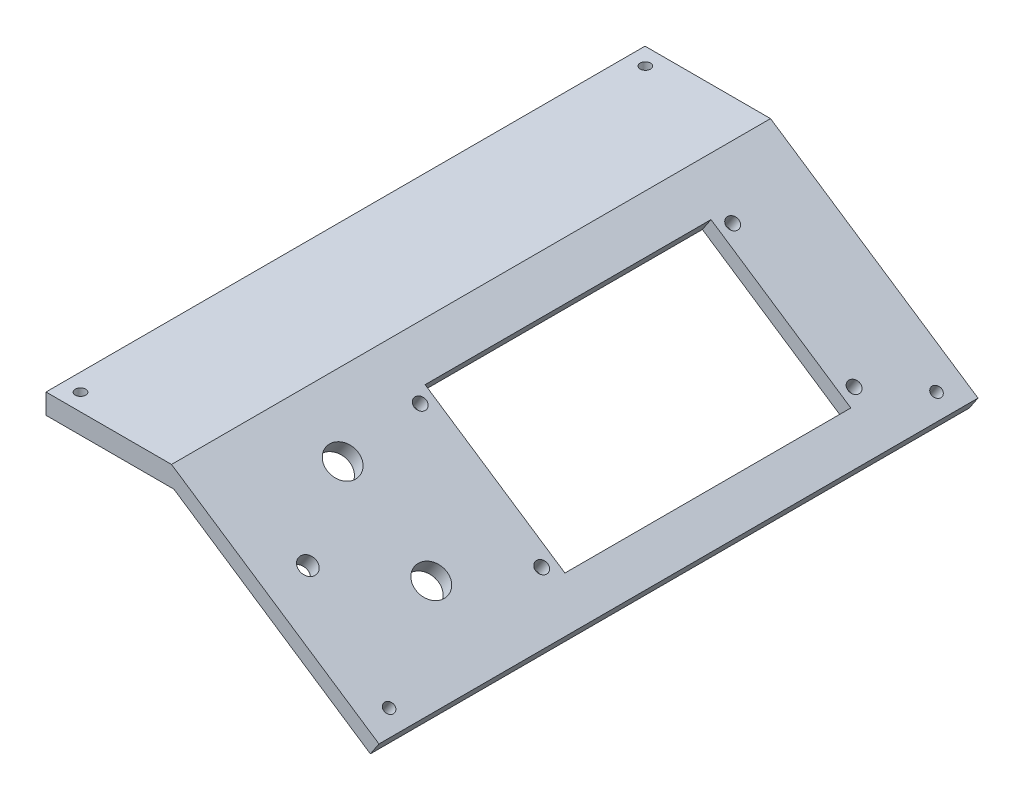
ISO-10303-21;
HEADER;
FILE_DESCRIPTION(('STEP AP214'),'2;1');
FILE_NAME('part.step','',(''),(''),'','','');
FILE_SCHEMA(('AUTOMOTIVE_DESIGN { 1 0 10303 214 1 1 1 1 }'));
ENDSEC;
DATA;
#1=APPLICATION_CONTEXT('core data for automotive mechanical design processes');
#2=APPLICATION_PROTOCOL_DEFINITION('international standard','automotive_design',2000,#1);
#3=PRODUCT_CONTEXT('',#1,'mechanical');
#4=PRODUCT('Part','Part','',(#3));
#5=PRODUCT_RELATED_PRODUCT_CATEGORY('part','',(#4));
#6=PRODUCT_DEFINITION_FORMATION('','',#4);
#7=PRODUCT_DEFINITION_CONTEXT('part definition',#1,'design');
#8=PRODUCT_DEFINITION('design','',#6,#7);
#9=PRODUCT_DEFINITION_SHAPE('','',#8);
#10=(LENGTH_UNIT() NAMED_UNIT(*) SI_UNIT(.MILLI.,.METRE.));
#11=(NAMED_UNIT(*) PLANE_ANGLE_UNIT() SI_UNIT($,.RADIAN.));
#12=(NAMED_UNIT(*) SI_UNIT($,.STERADIAN.) SOLID_ANGLE_UNIT());
#13=UNCERTAINTY_MEASURE_WITH_UNIT(LENGTH_MEASURE(1.E-05),#10,'distance_accuracy_value','');
#14=(GEOMETRIC_REPRESENTATION_CONTEXT(3) GLOBAL_UNCERTAINTY_ASSIGNED_CONTEXT((#13)) GLOBAL_UNIT_ASSIGNED_CONTEXT((#10,
#11,#12)) REPRESENTATION_CONTEXT('',''));
#15=CARTESIAN_POINT('',(0.,0.,0.));
#16=DIRECTION('',(0.,0.,1.));
#17=DIRECTION('',(1.,0.,0.));
#18=AXIS2_PLACEMENT_3D('',#15,#16,#17);
#19=CARTESIAN_POINT('',(0.,0.,171.8));
#20=DIRECTION('',(1.,0.,0.));
#21=DIRECTION('',(0.,1.,0.));
#22=AXIS2_PLACEMENT_3D('',#19,#20,#21);
#23=PLANE('',#22);
#24=DIRECTION('',(0.,-1.,0.));
#25=VECTOR('',#24,1.);
#26=CARTESIAN_POINT('',(0.,0.,0.));
#27=LINE('',#26,#25);
#28=CARTESIAN_POINT('',(0.,0.,0.));
#29=VERTEX_POINT('',#28);
#30=CARTESIAN_POINT('',(0.,-5.8,0.));
#31=VERTEX_POINT('',#30);
#32=EDGE_CURVE('E214',#29,#31,#27,.T.);
#33=ORIENTED_EDGE('',*,*,#32,.T.);
#34=DIRECTION('',(0.,0.,-1.));
#35=VECTOR('',#34,1.);
#36=CARTESIAN_POINT('',(0.,-5.8,171.8));
#37=LINE('',#36,#35);
#38=CARTESIAN_POINT('',(0.,-5.8,171.8));
#39=VERTEX_POINT('',#38);
#40=EDGE_CURVE('E11',#39,#31,#37,.T.);
#41=ORIENTED_EDGE('',*,*,#40,.F.);
#42=DIRECTION('',(0.,-1.,0.));
#43=VECTOR('',#42,1.);
#44=CARTESIAN_POINT('',(0.,0.,171.8));
#45=LINE('',#44,#43);
#46=CARTESIAN_POINT('',(0.,0.,171.8));
#47=VERTEX_POINT('',#46);
#48=EDGE_CURVE('E215',#47,#39,#45,.T.);
#49=ORIENTED_EDGE('',*,*,#48,.F.);
#50=DIRECTION('',(0.,0.,-1.));
#51=VECTOR('',#50,1.);
#52=CARTESIAN_POINT('',(0.,0.,171.8));
#53=LINE('',#52,#51);
#54=EDGE_CURVE('E235',#47,#29,#53,.T.);
#55=ORIENTED_EDGE('',*,*,#54,.T.);
#56=EDGE_LOOP('',(#33,#41,#49,#55));
#57=FACE_BOUND('',#56,.T.);
#58=ADVANCED_FACE('F38',(#57),#23,.F.);
#59=CARTESIAN_POINT('',(0.,-5.8,171.8));
#60=DIRECTION('',(0.,1.,0.));
#61=DIRECTION('',(0.,0.,1.));
#62=AXIS2_PLACEMENT_3D('',#59,#60,#61);
#63=PLANE('',#62);
#64=CARTESIAN_POINT('',(5.,-5.8,166.9));
#65=DIRECTION('',(0.,1.,0.));
#66=DIRECTION('',(0.,0.,1.));
#67=AXIS2_PLACEMENT_3D('',#64,#65,#66);
#68=CIRCLE('',#67,1.5);
#69=CARTESIAN_POINT('',(5.,-5.8,168.4));
#70=VERTEX_POINT('',#69);
#71=EDGE_CURVE('E161',#70,#70,#68,.T.);
#72=ORIENTED_EDGE('',*,*,#71,.T.);
#73=EDGE_LOOP('',(#72));
#74=FACE_BOUND('',#73,.T.);
#75=CARTESIAN_POINT('',(5.,-5.8,4.90000000000001));
#76=DIRECTION('',(0.,1.,0.));
#77=DIRECTION('',(0.,0.,1.));
#78=AXIS2_PLACEMENT_3D('',#75,#76,#77);
#79=CIRCLE('',#78,1.5);
#80=CARTESIAN_POINT('',(5.,-5.8,6.40000000000001));
#81=VERTEX_POINT('',#80);
#82=EDGE_CURVE('E506',#81,#81,#79,.T.);
#83=ORIENTED_EDGE('',*,*,#82,.T.);
#84=EDGE_LOOP('',(#83));
#85=FACE_BOUND('',#84,.T.);
#86=DIRECTION('',(1.,0.,0.));
#87=VECTOR('',#86,1.);
#88=CARTESIAN_POINT('',(0.,-5.8,0.));
#89=LINE('',#88,#87);
#90=CARTESIAN_POINT('',(36.6776484120926,-5.8,0.));
#91=VERTEX_POINT('',#90);
#92=EDGE_CURVE('E239',#31,#91,#89,.T.);
#93=ORIENTED_EDGE('',*,*,#92,.T.);
#94=DIRECTION('',(0.,0.,-1.));
#95=VECTOR('',#94,1.);
#96=CARTESIAN_POINT('',(36.6776484120926,-5.8,171.8));
#97=LINE('',#96,#95);
#98=CARTESIAN_POINT('',(36.6776484120926,-5.8,171.8));
#99=VERTEX_POINT('',#98);
#100=EDGE_CURVE('E46',#99,#91,#97,.T.);
#101=ORIENTED_EDGE('',*,*,#100,.F.);
#102=DIRECTION('',(1.,0.,0.));
#103=VECTOR('',#102,1.);
#104=CARTESIAN_POINT('',(0.,-5.8,171.8));
#105=LINE('',#104,#103);
#106=EDGE_CURVE('E219',#39,#99,#105,.T.);
#107=ORIENTED_EDGE('',*,*,#106,.F.);
#108=ORIENTED_EDGE('',*,*,#40,.T.);
#109=EDGE_LOOP('',(#93,#101,#107,#108));
#110=FACE_BOUND('',#109,.T.);
#111=ADVANCED_FACE('F295',(#74,#85,#110),#63,.F.);
#112=CARTESIAN_POINT('',(93.032353950195,-43.3698036920683,171.8));
#113=DIRECTION('',(0.554700196225229,0.832050294337844,0.));
#114=DIRECTION('',(-0.832050294337844,0.554700196225229,0.));
#115=AXIS2_PLACEMENT_3D('',#112,#113,#114);
#116=PLANE('',#115);
#117=CARTESIAN_POINT('',(88.5392823607707,-40.374422632452,7.40000000000001));
#118=DIRECTION('',(0.554700196225229,0.832050294337844,0.));
#119=DIRECTION('',(-0.832050294337844,0.554700196225229,0.));
#120=AXIS2_PLACEMENT_3D('',#117,#118,#119);
#121=CIRCLE('',#120,1.5);
#122=CARTESIAN_POINT('',(87.2912069192639,-39.5423723381142,7.40000000000001));
#123=VERTEX_POINT('',#122);
#124=EDGE_CURVE('E210',#123,#123,#121,.T.);
#125=ORIENTED_EDGE('',*,*,#124,.T.);
#126=EDGE_LOOP('',(#125));
#127=FACE_BOUND('',#126,.T.);
#128=CARTESIAN_POINT('',(45.8671563780053,-11.9263386439418,112.8));
#129=DIRECTION('',(0.554700196225229,0.832050294337844,0.));
#130=DIRECTION('',(-0.832050294337844,0.554700196225229,0.));
#131=AXIS2_PLACEMENT_3D('',#128,#129,#130);
#132=CIRCLE('',#131,1.75000000000001);
#133=CARTESIAN_POINT('',(44.4110683629141,-10.9556133005476,112.8));
#134=VERTEX_POINT('',#133);
#135=EDGE_CURVE('E206',#134,#134,#132,.T.);
#136=ORIENTED_EDGE('',*,*,#135,.T.);
#137=EDGE_LOOP('',(#136));
#138=FACE_BOUND('',#137,.T.);
#139=CARTESIAN_POINT('',(60.3327773827178,-21.5700859804168,159.5));
#140=DIRECTION('',(0.554700196225229,0.832050294337844,0.));
#141=DIRECTION('',(-0.832050294337844,0.554700196225229,0.));
#142=AXIS2_PLACEMENT_3D('',#139,#140,#141);
#143=CIRCLE('',#142,2.5);
#144=CARTESIAN_POINT('',(58.2526516468732,-20.1833354898537,159.5));
#145=VERTEX_POINT('',#144);
#146=EDGE_CURVE('E202',#145,#145,#143,.T.);
#147=ORIENTED_EDGE('',*,*,#146,.T.);
#148=EDGE_LOOP('',(#147));
#149=FACE_BOUND('',#148,.T.);
#150=CARTESIAN_POINT('',(73.2295569449544,-30.1679390219078,137.));
#151=DIRECTION('',(0.554700196225229,0.832050294337844,0.));
#152=DIRECTION('',(-0.832050294337844,0.554700196225229,0.));
#153=AXIS2_PLACEMENT_3D('',#150,#151,#152);
#154=CIRCLE('',#153,4.50000000000001);
#155=CARTESIAN_POINT('',(69.4853306204341,-27.6717881388943,137.));
#156=VERTEX_POINT('',#155);
#157=EDGE_CURVE('E198',#156,#156,#154,.T.);
#158=ORIENTED_EDGE('',*,*,#157,.T.);
#159=EDGE_LOOP('',(#158));
#160=FACE_BOUND('',#159,.T.);
#161=DIRECTION('',(0.,0.,-1.));
#162=VECTOR('',#161,1.);
#163=CARTESIAN_POINT('',(83.5623532528284,-37.0564698938239,171.8));
#164=LINE('',#163,#162);
#165=CARTESIAN_POINT('',(83.5623532528284,-37.0564698938239,109.));
#166=VERTEX_POINT('',#165);
#167=CARTESIAN_POINT('',(83.5623532528284,-37.0564698938239,27.));
#168=VERTEX_POINT('',#167);
#169=EDGE_CURVE('E190',#166,#168,#164,.T.);
#170=ORIENTED_EDGE('',*,*,#169,.T.);
#171=DIRECTION('',(-0.832050294337844,0.554700196225229,0.));
#172=VECTOR('',#171,1.);
#173=CARTESIAN_POINT('',(93.032353950195,-43.3698036920683,27.));
#174=LINE('',#173,#172);
#175=CARTESIAN_POINT('',(43.4575290657444,-10.3199204357678,27.));
#176=VERTEX_POINT('',#175);
#177=EDGE_CURVE('E194',#168,#176,#174,.T.);
#178=ORIENTED_EDGE('',*,*,#177,.T.);
#179=DIRECTION('',(0.,0.,1.));
#180=VECTOR('',#179,1.);
#181=CARTESIAN_POINT('',(43.4575290657444,-10.3199204357678,171.8));
#182=LINE('',#181,#180);
#183=CARTESIAN_POINT('',(43.4575290657444,-10.3199204357678,109.));
#184=VERTEX_POINT('',#183);
#185=EDGE_CURVE('E185',#176,#184,#182,.T.);
#186=ORIENTED_EDGE('',*,*,#185,.T.);
#187=DIRECTION('',(0.832050294337844,-0.554700196225229,0.));
#188=VECTOR('',#187,1.);
#189=CARTESIAN_POINT('',(93.032353950195,-43.3698036920683,109.));
#190=LINE('',#189,#188);
#191=EDGE_CURVE('E121',#184,#166,#190,.T.);
#192=ORIENTED_EDGE('',*,*,#191,.T.);
#193=EDGE_LOOP('',(#170,#178,#186,#192));
#194=FACE_BOUND('',#193,.T.);
#195=CARTESIAN_POINT('',(88.5392823607707,-40.374422632452,164.4));
#196=DIRECTION('',(0.554700196225229,0.832050294337844,0.));
#197=DIRECTION('',(-0.832050294337844,0.554700196225229,0.));
#198=AXIS2_PLACEMENT_3D('',#195,#196,#197);
#199=CIRCLE('',#198,1.5);
#200=CARTESIAN_POINT('',(87.2912069192639,-39.5423723381142,164.4));
#201=VERTEX_POINT('',#200);
#202=EDGE_CURVE('E181',#201,#201,#199,.T.);
#203=ORIENTED_EDGE('',*,*,#202,.T.);
#204=EDGE_LOOP('',(#203));
#205=FACE_BOUND('',#204,.T.);
#206=CARTESIAN_POINT('',(80.6967816989875,-35.1460888579299,23.2));
#207=DIRECTION('',(0.554700196225229,0.832050294337844,0.));
#208=DIRECTION('',(-0.832050294337844,0.554700196225229,0.));
#209=AXIS2_PLACEMENT_3D('',#206,#207,#208);
#210=CIRCLE('',#209,1.74999999999999);
#211=CARTESIAN_POINT('',(79.2406936838962,-34.1753635145357,23.2));
#212=VERTEX_POINT('',#211);
#213=EDGE_CURVE('E177',#212,#212,#210,.T.);
#214=ORIENTED_EDGE('',*,*,#213,.T.);
#215=EDGE_LOOP('',(#214));
#216=FACE_BOUND('',#215,.T.);
#217=CARTESIAN_POINT('',(45.8671563780053,-11.9263386439418,23.2));
#218=DIRECTION('',(0.554700196225229,0.832050294337844,0.));
#219=DIRECTION('',(-0.832050294337844,0.554700196225229,0.));
#220=AXIS2_PLACEMENT_3D('',#217,#218,#219);
#221=CIRCLE('',#220,1.75000000000001);
#222=CARTESIAN_POINT('',(44.4110683629141,-10.9556133005476,23.2));
#223=VERTEX_POINT('',#222);
#224=EDGE_CURVE('E173',#223,#223,#221,.T.);
#225=ORIENTED_EDGE('',*,*,#224,.T.);
#226=EDGE_LOOP('',(#225));
#227=FACE_BOUND('',#226,.T.);
#228=CARTESIAN_POINT('',(80.6967816989875,-35.1460888579299,112.8));
#229=DIRECTION('',(0.554700196225229,0.832050294337844,0.));
#230=DIRECTION('',(-0.832050294337844,0.554700196225229,0.));
#231=AXIS2_PLACEMENT_3D('',#228,#229,#230);
#232=CIRCLE('',#231,1.74999999999999);
#233=CARTESIAN_POINT('',(79.2406936838962,-34.1753635145357,112.8));
#234=VERTEX_POINT('',#233);
#235=EDGE_CURVE('E169',#234,#234,#232,.T.);
#236=ORIENTED_EDGE('',*,*,#235,.T.);
#237=EDGE_LOOP('',(#236));
#238=FACE_BOUND('',#237,.T.);
#239=CARTESIAN_POINT('',(47.8131944490798,-13.2236973579914,137.));
#240=DIRECTION('',(0.554700196225229,0.832050294337844,0.));
#241=DIRECTION('',(-0.832050294337844,0.554700196225229,0.));
#242=AXIS2_PLACEMENT_3D('',#239,#240,#241);
#243=CIRCLE('',#242,4.5);
#244=CARTESIAN_POINT('',(44.0689681245595,-10.7275464749779,137.));
#245=VERTEX_POINT('',#244);
#246=EDGE_CURVE('E165',#245,#245,#243,.T.);
#247=ORIENTED_EDGE('',*,*,#246,.T.);
#248=EDGE_LOOP('',(#247));
#249=FACE_BOUND('',#248,.T.);
#250=DIRECTION('',(0.832050294337844,-0.554700196225229,0.));
#251=VECTOR('',#250,1.);
#252=CARTESIAN_POINT('',(93.032353950195,-43.3698036920683,0.));
#253=LINE('',#252,#251);
#254=CARTESIAN_POINT('',(93.032353950195,-43.3698036920683,0.));
#255=VERTEX_POINT('',#254);
#256=EDGE_CURVE('E242',#91,#255,#253,.T.);
#257=ORIENTED_EDGE('',*,*,#256,.T.);
#258=DIRECTION('',(0.,0.,-1.));
#259=VECTOR('',#258,1.);
#260=CARTESIAN_POINT('',(93.032353950195,-43.3698036920683,171.8));
#261=LINE('',#260,#259);
#262=CARTESIAN_POINT('',(93.032353950195,-43.3698036920683,171.8));
#263=VERTEX_POINT('',#262);
#264=EDGE_CURVE('E264',#263,#255,#261,.T.);
#265=ORIENTED_EDGE('',*,*,#264,.F.);
#266=DIRECTION('',(0.832050294337844,-0.554700196225229,0.));
#267=VECTOR('',#266,1.);
#268=CARTESIAN_POINT('',(93.032353950195,-43.3698036920683,171.8));
#269=LINE('',#268,#267);
#270=EDGE_CURVE('E223',#99,#263,#269,.T.);
#271=ORIENTED_EDGE('',*,*,#270,.F.);
#272=ORIENTED_EDGE('',*,*,#100,.T.);
#273=EDGE_LOOP('',(#257,#265,#271,#272));
#274=FACE_BOUND('',#273,.T.);
#275=ADVANCED_FACE('F273',(#127,#138,#149,#160,#194,#205,#216,#227,#238,#249,#274),#116,.F.);
#276=CARTESIAN_POINT('',(95.5007698233973,-39.6671798822649,171.8));
#277=DIRECTION('',(-0.832050294337843,0.554700196225231,0.));
#278=DIRECTION('',(-0.554700196225231,-0.832050294337843,0.));
#279=AXIS2_PLACEMENT_3D('',#276,#277,#278);
#280=PLANE('',#279);
#281=DIRECTION('',(0.554700196225231,0.832050294337843,0.));
#282=VECTOR('',#281,1.);
#283=CARTESIAN_POINT('',(95.5007698233973,-39.6671798822649,0.));
#284=LINE('',#283,#282);
#285=CARTESIAN_POINT('',(95.5007698233973,-39.6671798822649,0.));
#286=VERTEX_POINT('',#285);
#287=EDGE_CURVE('E245',#255,#286,#284,.T.);
#288=ORIENTED_EDGE('',*,*,#287,.T.);
#289=DIRECTION('',(0.,0.,-1.));
#290=VECTOR('',#289,1.);
#291=CARTESIAN_POINT('',(95.5007698233973,-39.6671798822649,171.8));
#292=LINE('',#291,#290);
#293=CARTESIAN_POINT('',(95.5007698233973,-39.6671798822649,171.8));
#294=VERTEX_POINT('',#293);
#295=EDGE_CURVE('E260',#294,#286,#292,.T.);
#296=ORIENTED_EDGE('',*,*,#295,.F.);
#297=DIRECTION('',(0.554700196225231,0.832050294337843,0.));
#298=VECTOR('',#297,1.);
#299=CARTESIAN_POINT('',(95.5007698233973,-39.6671798822649,171.8));
#300=LINE('',#299,#298);
#301=EDGE_CURVE('E226',#263,#294,#300,.T.);
#302=ORIENTED_EDGE('',*,*,#301,.F.);
#303=ORIENTED_EDGE('',*,*,#264,.T.);
#304=EDGE_LOOP('',(#288,#296,#302,#303));
#305=FACE_BOUND('',#304,.T.);
#306=ADVANCED_FACE('F284',(#305),#280,.F.);
#307=CARTESIAN_POINT('',(95.5007698233973,-39.6671798822649,171.8));
#308=DIRECTION('',(-0.554700196225229,-0.832050294337844,0.));
#309=DIRECTION('',(0.832050294337844,-0.554700196225229,0.));
#310=AXIS2_PLACEMENT_3D('',#307,#308,#309);
#311=PLANE('',#310);
#312=CARTESIAN_POINT('',(91.0076982339729,-36.6717988226486,7.40000000000001));
#313=DIRECTION('',(0.554700196225229,0.832050294337844,0.));
#314=DIRECTION('',(-0.832050294337844,0.554700196225229,0.));
#315=AXIS2_PLACEMENT_3D('',#312,#313,#314);
#316=CIRCLE('',#315,1.5);
#317=CARTESIAN_POINT('',(89.7596227924662,-35.8397485283108,7.40000000000001));
#318=VERTEX_POINT('',#317);
#319=EDGE_CURVE('E156',#318,#318,#316,.T.);
#320=ORIENTED_EDGE('',*,*,#319,.F.);
#321=EDGE_LOOP('',(#320));
#322=FACE_BOUND('',#321,.T.);
#323=CARTESIAN_POINT('',(48.3355722512076,-8.22371483413838,112.8));
#324=DIRECTION('',(0.554700196225229,0.832050294337844,0.));
#325=DIRECTION('',(-0.832050294337844,0.554700196225229,0.));
#326=AXIS2_PLACEMENT_3D('',#323,#324,#325);
#327=CIRCLE('',#326,1.75000000000001);
#328=CARTESIAN_POINT('',(46.8794842361163,-7.25298949074423,112.8));
#329=VERTEX_POINT('',#328);
#330=EDGE_CURVE('E525',#329,#329,#327,.T.);
#331=ORIENTED_EDGE('',*,*,#330,.F.);
#332=EDGE_LOOP('',(#331));
#333=FACE_BOUND('',#332,.T.);
#334=CARTESIAN_POINT('',(62.8011932559201,-17.8674621706134,159.5));
#335=DIRECTION('',(0.554700196225229,0.832050294337844,0.));
#336=DIRECTION('',(-0.832050294337844,0.554700196225229,0.));
#337=AXIS2_PLACEMENT_3D('',#334,#335,#336);
#338=CIRCLE('',#337,2.5);
#339=CARTESIAN_POINT('',(60.7210675200754,-16.4807116800503,159.5));
#340=VERTEX_POINT('',#339);
#341=EDGE_CURVE('E155',#340,#340,#338,.T.);
#342=ORIENTED_EDGE('',*,*,#341,.F.);
#343=EDGE_LOOP('',(#342));
#344=FACE_BOUND('',#343,.T.);
#345=CARTESIAN_POINT('',(75.6979728181566,-26.4653152121044,137.));
#346=DIRECTION('',(0.554700196225229,0.832050294337844,0.));
#347=DIRECTION('',(-0.832050294337844,0.554700196225229,0.));
#348=AXIS2_PLACEMENT_3D('',#345,#346,#347);
#349=CIRCLE('',#348,4.50000000000001);
#350=CARTESIAN_POINT('',(71.9537464936363,-23.9691643290909,137.));
#351=VERTEX_POINT('',#350);
#352=EDGE_CURVE('E151',#351,#351,#349,.T.);
#353=ORIENTED_EDGE('',*,*,#352,.F.);
#354=EDGE_LOOP('',(#353));
#355=FACE_BOUND('',#354,.T.);
#356=DIRECTION('',(0.,0.,1.));
#357=VECTOR('',#356,1.);
#358=CARTESIAN_POINT('',(45.9259449389466,-6.61729662596443,27.));
#359=LINE('',#358,#357);
#360=CARTESIAN_POINT('',(45.9259449389466,-6.61729662596443,27.));
#361=VERTEX_POINT('',#360);
#362=CARTESIAN_POINT('',(45.9259449389466,-6.61729662596443,109.));
#363=VERTEX_POINT('',#362);
#364=EDGE_CURVE('E128',#361,#363,#359,.T.);
#365=ORIENTED_EDGE('',*,*,#364,.F.);
#366=DIRECTION('',(-0.832050294337844,0.554700196225229,0.));
#367=VECTOR('',#366,1.);
#368=CARTESIAN_POINT('',(45.9259449389466,-6.61729662596443,27.));
#369=LINE('',#368,#367);
#370=CARTESIAN_POINT('',(86.0307691260307,-33.3538460840205,27.));
#371=VERTEX_POINT('',#370);
#372=EDGE_CURVE('E61',#371,#361,#369,.T.);
#373=ORIENTED_EDGE('',*,*,#372,.F.);
#374=DIRECTION('',(0.,0.,-1.));
#375=VECTOR('',#374,1.);
#376=CARTESIAN_POINT('',(86.0307691260307,-33.3538460840205,27.));
#377=LINE('',#376,#375);
#378=CARTESIAN_POINT('',(86.0307691260307,-33.3538460840205,109.));
#379=VERTEX_POINT('',#378);
#380=EDGE_CURVE('E136',#379,#371,#377,.T.);
#381=ORIENTED_EDGE('',*,*,#380,.F.);
#382=DIRECTION('',(0.832050294337844,-0.554700196225229,0.));
#383=VECTOR('',#382,1.);
#384=CARTESIAN_POINT('',(45.9259449389466,-6.61729662596443,109.));
#385=LINE('',#384,#383);
#386=EDGE_CURVE('E118',#363,#379,#385,.T.);
#387=ORIENTED_EDGE('',*,*,#386,.F.);
#388=EDGE_LOOP('',(#365,#373,#381,#387));
#389=FACE_BOUND('',#388,.T.);
#390=CARTESIAN_POINT('',(91.0076982339729,-36.6717988226486,164.4));
#391=DIRECTION('',(0.554700196225229,0.832050294337844,0.));
#392=DIRECTION('',(-0.832050294337844,0.554700196225229,0.));
#393=AXIS2_PLACEMENT_3D('',#390,#391,#392);
#394=CIRCLE('',#393,1.5);
#395=CARTESIAN_POINT('',(89.7596227924662,-35.8397485283108,164.4));
#396=VERTEX_POINT('',#395);
#397=EDGE_CURVE('E160',#396,#396,#394,.T.);
#398=ORIENTED_EDGE('',*,*,#397,.F.);
#399=EDGE_LOOP('',(#398));
#400=FACE_BOUND('',#399,.T.);
#401=CARTESIAN_POINT('',(83.1651975721897,-31.4434650481265,23.2));
#402=DIRECTION('',(0.554700196225229,0.832050294337844,0.));
#403=DIRECTION('',(-0.832050294337844,0.554700196225229,0.));
#404=AXIS2_PLACEMENT_3D('',#401,#402,#403);
#405=CIRCLE('',#404,1.74999999999999);
#406=CARTESIAN_POINT('',(81.7091095570985,-30.4727397047323,23.2));
#407=VERTEX_POINT('',#406);
#408=EDGE_CURVE('E513',#407,#407,#405,.T.);
#409=ORIENTED_EDGE('',*,*,#408,.F.);
#410=EDGE_LOOP('',(#409));
#411=FACE_BOUND('',#410,.T.);
#412=CARTESIAN_POINT('',(48.3355722512076,-8.22371483413838,23.2));
#413=DIRECTION('',(0.554700196225229,0.832050294337844,0.));
#414=DIRECTION('',(-0.832050294337844,0.554700196225229,0.));
#415=AXIS2_PLACEMENT_3D('',#412,#413,#414);
#416=CIRCLE('',#415,1.75000000000001);
#417=CARTESIAN_POINT('',(46.8794842361163,-7.25298949074423,23.2));
#418=VERTEX_POINT('',#417);
#419=EDGE_CURVE('E517',#418,#418,#416,.T.);
#420=ORIENTED_EDGE('',*,*,#419,.F.);
#421=EDGE_LOOP('',(#420));
#422=FACE_BOUND('',#421,.T.);
#423=CARTESIAN_POINT('',(83.1651975721897,-31.4434650481265,112.8));
#424=DIRECTION('',(0.554700196225229,0.832050294337844,0.));
#425=DIRECTION('',(-0.832050294337844,0.554700196225229,0.));
#426=AXIS2_PLACEMENT_3D('',#423,#424,#425);
#427=CIRCLE('',#426,1.74999999999999);
#428=CARTESIAN_POINT('',(81.7091095570985,-30.4727397047323,112.8));
#429=VERTEX_POINT('',#428);
#430=EDGE_CURVE('E521',#429,#429,#427,.T.);
#431=ORIENTED_EDGE('',*,*,#430,.F.);
#432=EDGE_LOOP('',(#431));
#433=FACE_BOUND('',#432,.T.);
#434=CARTESIAN_POINT('',(50.2816103222821,-9.52107354818804,137.));
#435=DIRECTION('',(0.554700196225229,0.832050294337844,0.));
#436=DIRECTION('',(-0.832050294337844,0.554700196225229,0.));
#437=AXIS2_PLACEMENT_3D('',#434,#435,#436);
#438=CIRCLE('',#437,4.5);
#439=CARTESIAN_POINT('',(46.5373839977618,-7.02492266517451,137.));
#440=VERTEX_POINT('',#439);
#441=EDGE_CURVE('E146',#440,#440,#438,.T.);
#442=ORIENTED_EDGE('',*,*,#441,.F.);
#443=EDGE_LOOP('',(#442));
#444=FACE_BOUND('',#443,.T.);
#445=DIRECTION('',(-0.832050294337844,0.554700196225229,0.));
#446=VECTOR('',#445,1.);
#447=CARTESIAN_POINT('',(95.5007698233973,-39.6671798822649,0.));
#448=LINE('',#447,#446);
#449=CARTESIAN_POINT('',(36.,0.,0.));
#450=VERTEX_POINT('',#449);
#451=EDGE_CURVE('E248',#286,#450,#448,.T.);
#452=ORIENTED_EDGE('',*,*,#451,.T.);
#453=DIRECTION('',(0.,0.,-1.));
#454=VECTOR('',#453,1.);
#455=CARTESIAN_POINT('',(36.,0.,171.8));
#456=LINE('',#455,#454);
#457=CARTESIAN_POINT('',(36.,0.,171.8));
#458=VERTEX_POINT('',#457);
#459=EDGE_CURVE('E256',#458,#450,#456,.T.);
#460=ORIENTED_EDGE('',*,*,#459,.F.);
#461=DIRECTION('',(-0.832050294337844,0.554700196225229,0.));
#462=VECTOR('',#461,1.);
#463=CARTESIAN_POINT('',(95.5007698233973,-39.6671798822649,171.8));
#464=LINE('',#463,#462);
#465=EDGE_CURVE('E229',#294,#458,#464,.T.);
#466=ORIENTED_EDGE('',*,*,#465,.F.);
#467=ORIENTED_EDGE('',*,*,#295,.T.);
#468=EDGE_LOOP('',(#452,#460,#466,#467));
#469=FACE_BOUND('',#468,.T.);
#470=ADVANCED_FACE('F133',(#322,#333,#344,#355,#389,#400,#411,#422,#433,#444,#469),#311,.F.);
#471=CARTESIAN_POINT('',(0.,0.,171.8));
#472=DIRECTION('',(0.,-1.,0.));
#473=DIRECTION('',(0.,0.,-1.));
#474=AXIS2_PLACEMENT_3D('',#471,#472,#473);
#475=PLANE('',#474);
#476=CARTESIAN_POINT('',(5.,0.,166.9));
#477=DIRECTION('',(0.,1.,0.));
#478=DIRECTION('',(0.,0.,1.));
#479=AXIS2_PLACEMENT_3D('',#476,#477,#478);
#480=CIRCLE('',#479,1.5);
#481=CARTESIAN_POINT('',(5.,0.,168.4));
#482=VERTEX_POINT('',#481);
#483=EDGE_CURVE('E503',#482,#482,#480,.T.);
#484=ORIENTED_EDGE('',*,*,#483,.F.);
#485=EDGE_LOOP('',(#484));
#486=FACE_BOUND('',#485,.T.);
#487=CARTESIAN_POINT('',(5.,0.,4.90000000000001));
#488=DIRECTION('',(0.,1.,0.));
#489=DIRECTION('',(0.,0.,1.));
#490=AXIS2_PLACEMENT_3D('',#487,#488,#489);
#491=CIRCLE('',#490,1.5);
#492=CARTESIAN_POINT('',(5.,0.,6.40000000000001));
#493=VERTEX_POINT('',#492);
#494=EDGE_CURVE('E576',#493,#493,#491,.T.);
#495=ORIENTED_EDGE('',*,*,#494,.F.);
#496=EDGE_LOOP('',(#495));
#497=FACE_BOUND('',#496,.T.);
#498=DIRECTION('',(-1.,0.,0.));
#499=VECTOR('',#498,1.);
#500=CARTESIAN_POINT('',(0.,0.,0.));
#501=LINE('',#500,#499);
#502=EDGE_CURVE('E220',#450,#29,#501,.T.);
#503=ORIENTED_EDGE('',*,*,#502,.T.);
#504=ORIENTED_EDGE('',*,*,#54,.F.);
#505=DIRECTION('',(-1.,0.,0.));
#506=VECTOR('',#505,1.);
#507=CARTESIAN_POINT('',(0.,0.,171.8));
#508=LINE('',#507,#506);
#509=EDGE_CURVE('E232',#458,#47,#508,.T.);
#510=ORIENTED_EDGE('',*,*,#509,.F.);
#511=ORIENTED_EDGE('',*,*,#459,.T.);
#512=EDGE_LOOP('',(#503,#504,#510,#511));
#513=FACE_BOUND('',#512,.T.);
#514=ADVANCED_FACE('F298',(#486,#497,#513),#475,.F.);
#515=CARTESIAN_POINT('',(0.,0.,171.8));
#516=DIRECTION('',(0.,0.,1.));
#517=DIRECTION('',(1.,0.,0.));
#518=AXIS2_PLACEMENT_3D('',#515,#516,#517);
#519=PLANE('',#518);
#520=ORIENTED_EDGE('',*,*,#48,.T.);
#521=ORIENTED_EDGE('',*,*,#106,.T.);
#522=ORIENTED_EDGE('',*,*,#270,.T.);
#523=ORIENTED_EDGE('',*,*,#301,.T.);
#524=ORIENTED_EDGE('',*,*,#465,.T.);
#525=ORIENTED_EDGE('',*,*,#509,.T.);
#526=EDGE_LOOP('',(#520,#521,#522,#523,#524,#525));
#527=FACE_BOUND('',#526,.T.);
#528=ADVANCED_FACE('F291',(#527),#519,.T.);
#529=CARTESIAN_POINT('',(0.,0.,0.));
#530=DIRECTION('',(0.,0.,1.));
#531=DIRECTION('',(1.,0.,0.));
#532=AXIS2_PLACEMENT_3D('',#529,#530,#531);
#533=PLANE('',#532);
#534=ORIENTED_EDGE('',*,*,#32,.F.);
#535=ORIENTED_EDGE('',*,*,#502,.F.);
#536=ORIENTED_EDGE('',*,*,#451,.F.);
#537=ORIENTED_EDGE('',*,*,#287,.F.);
#538=ORIENTED_EDGE('',*,*,#256,.F.);
#539=ORIENTED_EDGE('',*,*,#92,.F.);
#540=EDGE_LOOP('',(#534,#535,#536,#537,#538,#539));
#541=FACE_BOUND('',#540,.T.);
#542=ADVANCED_FACE('F279',(#541),#533,.F.);
#543=CARTESIAN_POINT('',(-0.639867691193965,-85.9032905684021,137.));
#544=DIRECTION('',(0.554700196225229,0.832050294337844,0.));
#545=DIRECTION('',(-0.832050294337844,0.554700196225229,0.));
#546=AXIS2_PLACEMENT_3D('',#543,#544,#545);
#547=CYLINDRICAL_SURFACE('',#546,4.5);
#548=ORIENTED_EDGE('',*,*,#441,.T.);
#549=EDGE_LOOP('',(#548));
#550=FACE_BOUND('',#549,.T.);
#551=ORIENTED_EDGE('',*,*,#246,.F.);
#552=EDGE_LOOP('',(#551));
#553=FACE_BOUND('',#552,.T.);
#554=ADVANCED_FACE('F354',(#550,#553),#547,.F.);
#555=CARTESIAN_POINT('',(32.2437195587137,-107.825682068341,112.8));
#556=DIRECTION('',(0.554700196225229,0.832050294337844,0.));
#557=DIRECTION('',(-0.832050294337844,0.554700196225229,0.));
#558=AXIS2_PLACEMENT_3D('',#555,#556,#557);
#559=CYLINDRICAL_SURFACE('',#558,1.74999999999999);
#560=ORIENTED_EDGE('',*,*,#430,.T.);
#561=EDGE_LOOP('',(#560));
#562=FACE_BOUND('',#561,.T.);
#563=ORIENTED_EDGE('',*,*,#235,.F.);
#564=EDGE_LOOP('',(#563));
#565=FACE_BOUND('',#564,.T.);
#566=ADVANCED_FACE('F359',(#562,#565),#559,.F.);
#567=CARTESIAN_POINT('',(-2.58590576226846,-84.6059318543524,23.2));
#568=DIRECTION('',(0.554700196225229,0.832050294337844,0.));
#569=DIRECTION('',(-0.832050294337844,0.554700196225229,0.));
#570=AXIS2_PLACEMENT_3D('',#567,#568,#569);
#571=CYLINDRICAL_SURFACE('',#570,1.75000000000001);
#572=ORIENTED_EDGE('',*,*,#419,.T.);
#573=EDGE_LOOP('',(#572));
#574=FACE_BOUND('',#573,.T.);
#575=ORIENTED_EDGE('',*,*,#224,.F.);
#576=EDGE_LOOP('',(#575));
#577=FACE_BOUND('',#576,.T.);
#578=ADVANCED_FACE('F367',(#574,#577),#571,.F.);
#579=CARTESIAN_POINT('',(32.2437195587137,-107.825682068341,23.2));
#580=DIRECTION('',(0.554700196225229,0.832050294337844,0.));
#581=DIRECTION('',(-0.832050294337844,0.554700196225229,0.));
#582=AXIS2_PLACEMENT_3D('',#579,#580,#581);
#583=CYLINDRICAL_SURFACE('',#582,1.74999999999999);
#584=ORIENTED_EDGE('',*,*,#408,.T.);
#585=EDGE_LOOP('',(#584));
#586=FACE_BOUND('',#585,.T.);
#587=ORIENTED_EDGE('',*,*,#213,.F.);
#588=EDGE_LOOP('',(#587));
#589=FACE_BOUND('',#588,.T.);
#590=ADVANCED_FACE('F375',(#586,#589),#583,.F.);
#591=CARTESIAN_POINT('',(40.0862202204969,-113.054015842863,164.4));
#592=DIRECTION('',(0.554700196225229,0.832050294337844,0.));
#593=DIRECTION('',(-0.832050294337844,0.554700196225229,0.));
#594=AXIS2_PLACEMENT_3D('',#591,#592,#593);
#595=CYLINDRICAL_SURFACE('',#594,1.5);
#596=ORIENTED_EDGE('',*,*,#397,.T.);
#597=EDGE_LOOP('',(#596));
#598=FACE_BOUND('',#597,.T.);
#599=ORIENTED_EDGE('',*,*,#202,.F.);
#600=EDGE_LOOP('',(#599));
#601=FACE_BOUND('',#600,.T.);
#602=ADVANCED_FACE('F383',(#598,#601),#595,.F.);
#603=CARTESIAN_POINT('',(-4.99553307452938,-82.9995136461785,27.));
#604=DIRECTION('',(0.,0.,-1.));
#605=DIRECTION('',(-1.,0.,0.));
#606=AXIS2_PLACEMENT_3D('',#603,#604,#605);
#607=PLANE('',#606);
#608=DIRECTION('',(0.554700196225229,0.832050294337844,0.));
#609=VECTOR('',#608,1.);
#610=CARTESIAN_POINT('',(35.1092911125547,-109.736063104235,27.));
#611=LINE('',#610,#609);
#612=EDGE_CURVE('E143',#168,#371,#611,.T.);
#613=ORIENTED_EDGE('',*,*,#612,.T.);
#614=ORIENTED_EDGE('',*,*,#372,.T.);
#615=DIRECTION('',(0.554700196225229,0.832050294337844,0.));
#616=VECTOR('',#615,1.);
#617=CARTESIAN_POINT('',(-4.99553307452938,-82.9995136461785,27.));
#618=LINE('',#617,#616);
#619=EDGE_CURVE('E125',#176,#361,#618,.T.);
#620=ORIENTED_EDGE('',*,*,#619,.F.);
#621=ORIENTED_EDGE('',*,*,#177,.F.);
#622=EDGE_LOOP('',(#613,#614,#620,#621));
#623=FACE_BOUND('',#622,.T.);
#624=ADVANCED_FACE('F391',(#623),#607,.F.);
#625=CARTESIAN_POINT('',(35.1092911125547,-109.736063104235,27.));
#626=DIRECTION('',(0.832050294337844,-0.554700196225229,0.));
#627=DIRECTION('',(0.554700196225229,0.832050294337844,0.));
#628=AXIS2_PLACEMENT_3D('',#625,#626,#627);
#629=PLANE('',#628);
#630=DIRECTION('',(0.554700196225229,0.832050294337844,0.));
#631=VECTOR('',#630,1.);
#632=CARTESIAN_POINT('',(35.1092911125547,-109.736063104235,109.));
#633=LINE('',#632,#631);
#634=EDGE_CURVE('E124',#166,#379,#633,.T.);
#635=ORIENTED_EDGE('',*,*,#634,.T.);
#636=ORIENTED_EDGE('',*,*,#380,.T.);
#637=ORIENTED_EDGE('',*,*,#612,.F.);
#638=ORIENTED_EDGE('',*,*,#169,.F.);
#639=EDGE_LOOP('',(#635,#636,#637,#638));
#640=FACE_BOUND('',#639,.T.);
#641=ADVANCED_FACE('F399',(#640),#629,.F.);
#642=CARTESIAN_POINT('',(-4.99553307452938,-82.9995136461785,109.));
#643=DIRECTION('',(0.,0.,1.));
#644=DIRECTION('',(1.,0.,0.));
#645=AXIS2_PLACEMENT_3D('',#642,#643,#644);
#646=PLANE('',#645);
#647=DIRECTION('',(0.554700196225229,0.832050294337844,0.));
#648=VECTOR('',#647,1.);
#649=CARTESIAN_POINT('',(-4.99553307452938,-82.9995136461785,109.));
#650=LINE('',#649,#648);
#651=EDGE_CURVE('E53',#184,#363,#650,.T.);
#652=ORIENTED_EDGE('',*,*,#651,.T.);
#653=ORIENTED_EDGE('',*,*,#386,.T.);
#654=ORIENTED_EDGE('',*,*,#634,.F.);
#655=ORIENTED_EDGE('',*,*,#191,.F.);
#656=EDGE_LOOP('',(#652,#653,#654,#655));
#657=FACE_BOUND('',#656,.T.);
#658=ADVANCED_FACE('F115',(#657),#646,.F.);
#659=CARTESIAN_POINT('',(-4.99553307452938,-82.9995136461785,27.));
#660=DIRECTION('',(-0.832050294337844,0.554700196225229,0.));
#661=DIRECTION('',(-0.554700196225229,-0.832050294337844,0.));
#662=AXIS2_PLACEMENT_3D('',#659,#660,#661);
#663=PLANE('',#662);
#664=ORIENTED_EDGE('',*,*,#619,.T.);
#665=ORIENTED_EDGE('',*,*,#364,.T.);
#666=ORIENTED_EDGE('',*,*,#651,.F.);
#667=ORIENTED_EDGE('',*,*,#185,.F.);
#668=EDGE_LOOP('',(#664,#665,#666,#667));
#669=FACE_BOUND('',#668,.T.);
#670=ADVANCED_FACE('F129',(#669),#663,.F.);
#671=CARTESIAN_POINT('',(24.7764948046806,-102.847532232318,137.));
#672=DIRECTION('',(0.554700196225229,0.832050294337844,0.));
#673=DIRECTION('',(-0.832050294337844,0.554700196225229,0.));
#674=AXIS2_PLACEMENT_3D('',#671,#672,#673);
#675=CYLINDRICAL_SURFACE('',#674,4.50000000000001);
#676=ORIENTED_EDGE('',*,*,#352,.T.);
#677=EDGE_LOOP('',(#676));
#678=FACE_BOUND('',#677,.T.);
#679=ORIENTED_EDGE('',*,*,#157,.F.);
#680=EDGE_LOOP('',(#679));
#681=FACE_BOUND('',#680,.T.);
#682=ADVANCED_FACE('F419',(#678,#681),#675,.F.);
#683=CARTESIAN_POINT('',(11.879715242444,-94.2496791908274,159.5));
#684=DIRECTION('',(0.554700196225229,0.832050294337844,0.));
#685=DIRECTION('',(-0.832050294337844,0.554700196225229,0.));
#686=AXIS2_PLACEMENT_3D('',#683,#684,#685);
#687=CYLINDRICAL_SURFACE('',#686,2.5);
#688=ORIENTED_EDGE('',*,*,#341,.T.);
#689=EDGE_LOOP('',(#688));
#690=FACE_BOUND('',#689,.T.);
#691=ORIENTED_EDGE('',*,*,#146,.F.);
#692=EDGE_LOOP('',(#691));
#693=FACE_BOUND('',#692,.T.);
#694=ADVANCED_FACE('F426',(#690,#693),#687,.F.);
#695=CARTESIAN_POINT('',(-2.58590576226846,-84.6059318543524,112.8));
#696=DIRECTION('',(0.554700196225229,0.832050294337844,0.));
#697=DIRECTION('',(-0.832050294337844,0.554700196225229,0.));
#698=AXIS2_PLACEMENT_3D('',#695,#696,#697);
#699=CYLINDRICAL_SURFACE('',#698,1.75000000000001);
#700=ORIENTED_EDGE('',*,*,#330,.T.);
#701=EDGE_LOOP('',(#700));
#702=FACE_BOUND('',#701,.T.);
#703=ORIENTED_EDGE('',*,*,#135,.F.);
#704=EDGE_LOOP('',(#703));
#705=FACE_BOUND('',#704,.T.);
#706=ADVANCED_FACE('F434',(#702,#705),#699,.F.);
#707=CARTESIAN_POINT('',(40.0862202204969,-113.054015842863,7.40000000000001));
#708=DIRECTION('',(0.554700196225229,0.832050294337844,0.));
#709=DIRECTION('',(-0.832050294337844,0.554700196225229,0.));
#710=AXIS2_PLACEMENT_3D('',#707,#708,#709);
#711=CYLINDRICAL_SURFACE('',#710,1.5);
#712=ORIENTED_EDGE('',*,*,#319,.T.);
#713=EDGE_LOOP('',(#712));
#714=FACE_BOUND('',#713,.T.);
#715=ORIENTED_EDGE('',*,*,#124,.F.);
#716=EDGE_LOOP('',(#715));
#717=FACE_BOUND('',#716,.T.);
#718=ADVANCED_FACE('F442',(#714,#717),#711,.F.);
#719=CARTESIAN_POINT('',(5.,-91.8,4.90000000000001));
#720=DIRECTION('',(0.,1.,0.));
#721=DIRECTION('',(0.,0.,1.));
#722=AXIS2_PLACEMENT_3D('',#719,#720,#721);
#723=CYLINDRICAL_SURFACE('',#722,1.5);
#724=ORIENTED_EDGE('',*,*,#494,.T.);
#725=EDGE_LOOP('',(#724));
#726=FACE_BOUND('',#725,.T.);
#727=ORIENTED_EDGE('',*,*,#82,.F.);
#728=EDGE_LOOP('',(#727));
#729=FACE_BOUND('',#728,.T.);
#730=ADVANCED_FACE('F449',(#726,#729),#723,.F.);
#731=CARTESIAN_POINT('',(5.,-91.8,166.9));
#732=DIRECTION('',(0.,1.,0.));
#733=DIRECTION('',(0.,0.,1.));
#734=AXIS2_PLACEMENT_3D('',#731,#732,#733);
#735=CYLINDRICAL_SURFACE('',#734,1.5);
#736=ORIENTED_EDGE('',*,*,#483,.T.);
#737=EDGE_LOOP('',(#736));
#738=FACE_BOUND('',#737,.T.);
#739=ORIENTED_EDGE('',*,*,#71,.F.);
#740=EDGE_LOOP('',(#739));
#741=FACE_BOUND('',#740,.T.);
#742=ADVANCED_FACE('F456',(#738,#741),#735,.F.);
#743=CLOSED_SHELL('',(#58,#111,#275,#306,#470,#514,#528,#542,#554,#566,#578,#590,#602,#624,#641,
#658,#670,#682,#694,#706,#718,#730,#742));
#744=MANIFOLD_SOLID_BREP('B2',#743);
#745=ADVANCED_BREP_SHAPE_REPRESENTATION('',(#18,#744),#14);
#746=SHAPE_DEFINITION_REPRESENTATION(#9,#745);
ENDSEC;
END-ISO-10303-21;
